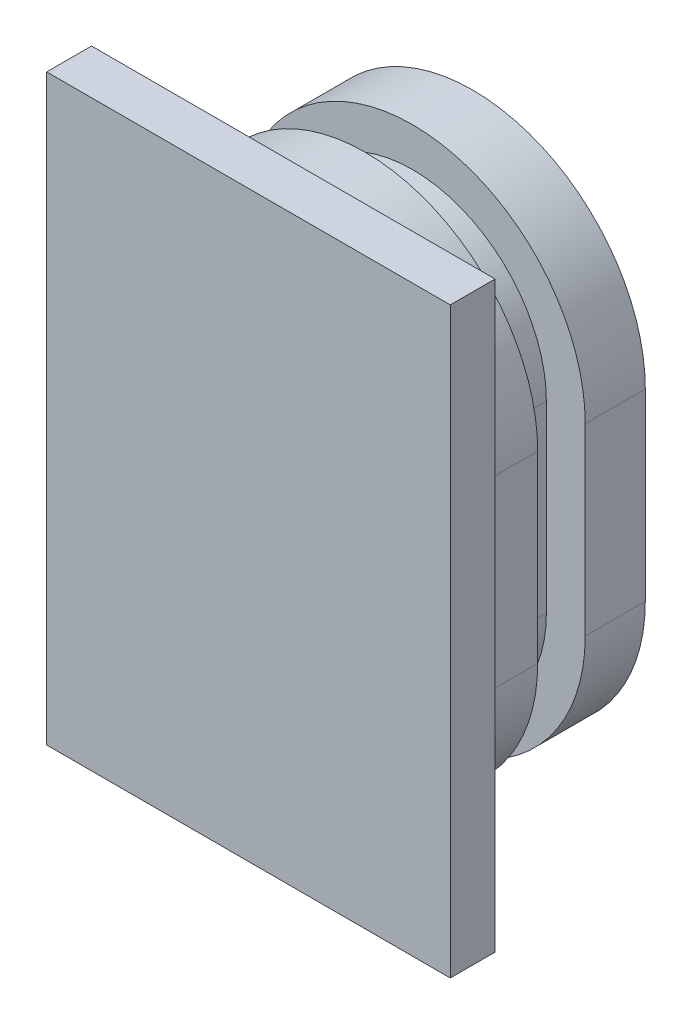
ISO-10303-21;
HEADER;
FILE_DESCRIPTION(('STEP AP214'),'2;1');
FILE_NAME('part.step','',(''),(''),'','','');
FILE_SCHEMA(('AUTOMOTIVE_DESIGN { 1 0 10303 214 1 1 1 1 }'));
ENDSEC;
DATA;
#1=APPLICATION_CONTEXT('core data for automotive mechanical design processes');
#2=APPLICATION_PROTOCOL_DEFINITION('international standard','automotive_design',2000,#1);
#3=PRODUCT_CONTEXT('',#1,'mechanical');
#4=PRODUCT('Part','Part','',(#3));
#5=PRODUCT_RELATED_PRODUCT_CATEGORY('part','',(#4));
#6=PRODUCT_DEFINITION_FORMATION('','',#4);
#7=PRODUCT_DEFINITION_CONTEXT('part definition',#1,'design');
#8=PRODUCT_DEFINITION('design','',#6,#7);
#9=PRODUCT_DEFINITION_SHAPE('','',#8);
#10=(LENGTH_UNIT() NAMED_UNIT(*) SI_UNIT(.MILLI.,.METRE.));
#11=(NAMED_UNIT(*) PLANE_ANGLE_UNIT() SI_UNIT($,.RADIAN.));
#12=(NAMED_UNIT(*) SI_UNIT($,.STERADIAN.) SOLID_ANGLE_UNIT());
#13=UNCERTAINTY_MEASURE_WITH_UNIT(LENGTH_MEASURE(1.E-05),#10,'distance_accuracy_value','');
#14=(GEOMETRIC_REPRESENTATION_CONTEXT(3) GLOBAL_UNCERTAINTY_ASSIGNED_CONTEXT((#13)) GLOBAL_UNIT_ASSIGNED_CONTEXT((#10,
#11,#12)) REPRESENTATION_CONTEXT('',''));
#15=CARTESIAN_POINT('',(0.,0.,0.));
#16=DIRECTION('',(0.,0.,1.));
#17=DIRECTION('',(1.,0.,0.));
#18=AXIS2_PLACEMENT_3D('',#15,#16,#17);
#19=CARTESIAN_POINT('',(2.88620795061788,-6.03673923854262,-20.));
#20=DIRECTION('',(0.,0.,-1.));
#21=DIRECTION('',(-1.,0.,0.));
#22=AXIS2_PLACEMENT_3D('',#19,#20,#21);
#23=PLANE('',#22);
#24=CARTESIAN_POINT('',(2.88620795061788,-6.03673923854262,-20.));
#25=DIRECTION('',(0.,0.,-1.));
#26=DIRECTION('',(-1.,0.,0.));
#27=AXIS2_PLACEMENT_3D('',#24,#25,#26);
#28=CIRCLE('',#27,19.25);
#29=CARTESIAN_POINT('',(-16.3637920493821,-6.03673923854262,-20.));
#30=VERTEX_POINT('',#29);
#31=CARTESIAN_POINT('',(22.1362079506179,-6.03673923854262,-20.));
#32=VERTEX_POINT('',#31);
#33=EDGE_CURVE('E302',#30,#32,#28,.T.);
#34=ORIENTED_EDGE('',*,*,#33,.T.);
#35=DIRECTION('',(0.,-1.,0.));
#36=VECTOR('',#35,1.);
#37=CARTESIAN_POINT('',(22.1362079506179,-6.03673923854262,-20.));
#38=LINE('',#37,#36);
#39=CARTESIAN_POINT('',(22.1362079506179,-26.5367392385426,-20.));
#40=VERTEX_POINT('',#39);
#41=EDGE_CURVE('E306',#32,#40,#38,.T.);
#42=ORIENTED_EDGE('',*,*,#41,.T.);
#43=CARTESIAN_POINT('',(2.88620795061788,-26.5367392385426,-20.));
#44=DIRECTION('',(0.,0.,-1.));
#45=DIRECTION('',(-1.,0.,0.));
#46=AXIS2_PLACEMENT_3D('',#43,#44,#45);
#47=CIRCLE('',#46,19.25);
#48=CARTESIAN_POINT('',(-16.3637920493821,-26.5367392385426,-20.));
#49=VERTEX_POINT('',#48);
#50=EDGE_CURVE('E310',#40,#49,#47,.T.);
#51=ORIENTED_EDGE('',*,*,#50,.T.);
#52=DIRECTION('',(0.,1.,0.));
#53=VECTOR('',#52,1.);
#54=CARTESIAN_POINT('',(-16.3637920493821,-6.03673923854262,-20.));
#55=LINE('',#54,#53);
#56=EDGE_CURVE('E313',#49,#30,#55,.T.);
#57=ORIENTED_EDGE('',*,*,#56,.T.);
#58=EDGE_LOOP('',(#34,#42,#51,#57));
#59=FACE_BOUND('',#58,.T.);
#60=DIRECTION('',(0.,-1.,0.));
#61=VECTOR('',#60,1.);
#62=CARTESIAN_POINT('',(13.6362079506179,-6.03673923854262,-20.));
#63=LINE('',#62,#61);
#64=CARTESIAN_POINT('',(13.6362079506179,-6.03673923854262,-20.));
#65=VERTEX_POINT('',#64);
#66=CARTESIAN_POINT('',(13.6362079506179,-26.5367392385426,-20.));
#67=VERTEX_POINT('',#66);
#68=EDGE_CURVE('E263',#65,#67,#63,.T.);
#69=ORIENTED_EDGE('',*,*,#68,.F.);
#70=CARTESIAN_POINT('',(2.88620795061788,-6.03673923854262,-20.));
#71=DIRECTION('',(0.,0.,-1.));
#72=DIRECTION('',(-1.,0.,0.));
#73=AXIS2_PLACEMENT_3D('',#70,#71,#72);
#74=CIRCLE('',#73,10.75);
#75=CARTESIAN_POINT('',(-7.86379204938211,-6.03673923854262,-20.));
#76=VERTEX_POINT('',#75);
#77=EDGE_CURVE('E260',#76,#65,#74,.T.);
#78=ORIENTED_EDGE('',*,*,#77,.F.);
#79=DIRECTION('',(0.,1.,0.));
#80=VECTOR('',#79,1.);
#81=CARTESIAN_POINT('',(-7.86379204938211,-6.03673923854262,-20.));
#82=LINE('',#81,#80);
#83=CARTESIAN_POINT('',(-7.86379204938211,-26.5367392385426,-20.));
#84=VERTEX_POINT('',#83);
#85=EDGE_CURVE('E271',#84,#76,#82,.T.);
#86=ORIENTED_EDGE('',*,*,#85,.F.);
#87=CARTESIAN_POINT('',(2.88620795061788,-26.5367392385426,-20.));
#88=DIRECTION('',(0.,0.,-1.));
#89=DIRECTION('',(-1.,0.,0.));
#90=AXIS2_PLACEMENT_3D('',#87,#88,#89);
#91=CIRCLE('',#90,10.75);
#92=EDGE_CURVE('E267',#67,#84,#91,.T.);
#93=ORIENTED_EDGE('',*,*,#92,.F.);
#94=EDGE_LOOP('',(#69,#78,#86,#93));
#95=FACE_BOUND('',#94,.T.);
#96=ADVANCED_FACE('F43',(#59,#95),#23,.T.);
#97=CARTESIAN_POINT('',(2.88620795061788,-6.03673923854262,-20.));
#98=DIRECTION('',(0.,0.,1.));
#99=DIRECTION('',(1.,0.,0.));
#100=AXIS2_PLACEMENT_3D('',#97,#98,#99);
#101=CYLINDRICAL_SURFACE('',#100,19.25);
#102=DIRECTION('',(0.,0.,1.));
#103=VECTOR('',#102,1.);
#104=CARTESIAN_POINT('',(-16.3637920493821,-6.03673923854262,-20.));
#105=LINE('',#104,#103);
#106=CARTESIAN_POINT('',(-16.3637920493821,-6.03673923854262,-13.3));
#107=VERTEX_POINT('',#106);
#108=EDGE_CURVE('E331',#30,#107,#105,.T.);
#109=ORIENTED_EDGE('',*,*,#108,.T.);
#110=CARTESIAN_POINT('',(2.88620795061788,-6.03673923854262,-13.3));
#111=DIRECTION('',(0.,0.,-1.));
#112=DIRECTION('',(-1.,0.,0.));
#113=AXIS2_PLACEMENT_3D('',#110,#111,#112);
#114=CIRCLE('',#113,19.25);
#115=CARTESIAN_POINT('',(22.1362079506179,-6.03673923854262,-13.3));
#116=VERTEX_POINT('',#115);
#117=EDGE_CURVE('E67',#107,#116,#114,.T.);
#118=ORIENTED_EDGE('',*,*,#117,.T.);
#119=DIRECTION('',(0.,0.,1.));
#120=VECTOR('',#119,1.);
#121=CARTESIAN_POINT('',(22.1362079506179,-6.03673923854262,-20.));
#122=LINE('',#121,#120);
#123=EDGE_CURVE('E346',#32,#116,#122,.T.);
#124=ORIENTED_EDGE('',*,*,#123,.F.);
#125=ORIENTED_EDGE('',*,*,#33,.F.);
#126=EDGE_LOOP('',(#109,#118,#124,#125));
#127=FACE_BOUND('',#126,.T.);
#128=ADVANCED_FACE('F416',(#127),#101,.T.);
#129=CARTESIAN_POINT('',(22.1362079506179,-6.03673923854262,-20.));
#130=DIRECTION('',(-1.,0.,0.));
#131=DIRECTION('',(0.,0.,1.));
#132=AXIS2_PLACEMENT_3D('',#129,#130,#131);
#133=PLANE('',#132);
#134=ORIENTED_EDGE('',*,*,#123,.T.);
#135=DIRECTION('',(0.,-1.,0.));
#136=VECTOR('',#135,1.);
#137=CARTESIAN_POINT('',(22.1362079506179,-6.03673923854262,-13.3));
#138=LINE('',#137,#136);
#139=CARTESIAN_POINT('',(22.1362079506179,-26.5367392385426,-13.3));
#140=VERTEX_POINT('',#139);
#141=EDGE_CURVE('E238',#116,#140,#138,.T.);
#142=ORIENTED_EDGE('',*,*,#141,.T.);
#143=DIRECTION('',(0.,0.,1.));
#144=VECTOR('',#143,1.);
#145=CARTESIAN_POINT('',(22.1362079506179,-26.5367392385426,-20.));
#146=LINE('',#145,#144);
#147=EDGE_CURVE('E341',#40,#140,#146,.T.);
#148=ORIENTED_EDGE('',*,*,#147,.F.);
#149=ORIENTED_EDGE('',*,*,#41,.F.);
#150=EDGE_LOOP('',(#134,#142,#148,#149));
#151=FACE_BOUND('',#150,.T.);
#152=ADVANCED_FACE('F422',(#151),#133,.F.);
#153=CARTESIAN_POINT('',(2.88620795061788,-26.5367392385426,-20.));
#154=DIRECTION('',(0.,0.,1.));
#155=DIRECTION('',(1.,0.,0.));
#156=AXIS2_PLACEMENT_3D('',#153,#154,#155);
#157=CYLINDRICAL_SURFACE('',#156,19.25);
#158=ORIENTED_EDGE('',*,*,#147,.T.);
#159=CARTESIAN_POINT('',(2.88620795061788,-26.5367392385426,-13.3));
#160=DIRECTION('',(0.,0.,-1.));
#161=DIRECTION('',(-1.,0.,0.));
#162=AXIS2_PLACEMENT_3D('',#159,#160,#161);
#163=CIRCLE('',#162,19.25);
#164=CARTESIAN_POINT('',(-16.3637920493821,-26.5367392385426,-13.3));
#165=VERTEX_POINT('',#164);
#166=EDGE_CURVE('E243',#140,#165,#163,.T.);
#167=ORIENTED_EDGE('',*,*,#166,.T.);
#168=DIRECTION('',(0.,0.,1.));
#169=VECTOR('',#168,1.);
#170=CARTESIAN_POINT('',(-16.3637920493821,-26.5367392385426,-20.));
#171=LINE('',#170,#169);
#172=EDGE_CURVE('E336',#49,#165,#171,.T.);
#173=ORIENTED_EDGE('',*,*,#172,.F.);
#174=ORIENTED_EDGE('',*,*,#50,.F.);
#175=EDGE_LOOP('',(#158,#167,#173,#174));
#176=FACE_BOUND('',#175,.T.);
#177=ADVANCED_FACE('F434',(#176),#157,.T.);
#178=CARTESIAN_POINT('',(-16.3637920493821,-6.03673923854262,-20.));
#179=DIRECTION('',(1.,0.,0.));
#180=DIRECTION('',(0.,0.,-1.));
#181=AXIS2_PLACEMENT_3D('',#178,#179,#180);
#182=PLANE('',#181);
#183=ORIENTED_EDGE('',*,*,#172,.T.);
#184=DIRECTION('',(0.,1.,0.));
#185=VECTOR('',#184,1.);
#186=CARTESIAN_POINT('',(-16.3637920493821,-6.03673923854262,-13.3));
#187=LINE('',#186,#185);
#188=EDGE_CURVE('E247',#165,#107,#187,.T.);
#189=ORIENTED_EDGE('',*,*,#188,.T.);
#190=ORIENTED_EDGE('',*,*,#108,.F.);
#191=ORIENTED_EDGE('',*,*,#56,.F.);
#192=EDGE_LOOP('',(#183,#189,#190,#191));
#193=FACE_BOUND('',#192,.T.);
#194=ADVANCED_FACE('F431',(#193),#182,.F.);
#195=CARTESIAN_POINT('',(2.88620795061788,-6.03673923854262,-20.));
#196=DIRECTION('',(0.,0.,1.));
#197=DIRECTION('',(1.,0.,0.));
#198=AXIS2_PLACEMENT_3D('',#195,#196,#197);
#199=CYLINDRICAL_SURFACE('',#198,10.75);
#200=CARTESIAN_POINT('',(2.88620795061788,-6.03673923854262,0.));
#201=DIRECTION('',(0.,0.,-1.));
#202=DIRECTION('',(-1.,0.,0.));
#203=AXIS2_PLACEMENT_3D('',#200,#201,#202);
#204=CIRCLE('',#203,10.75);
#205=CARTESIAN_POINT('',(-7.86379204938211,-6.03673923854262,0.));
#206=VERTEX_POINT('',#205);
#207=CARTESIAN_POINT('',(13.6362079506179,-6.03673923854262,0.));
#208=VERTEX_POINT('',#207);
#209=EDGE_CURVE('E250',#206,#208,#204,.T.);
#210=ORIENTED_EDGE('',*,*,#209,.F.);
#211=DIRECTION('',(0.,0.,1.));
#212=VECTOR('',#211,1.);
#213=CARTESIAN_POINT('',(-7.86379204938211,-6.03673923854262,-20.));
#214=LINE('',#213,#212);
#215=EDGE_CURVE('E274',#76,#206,#214,.T.);
#216=ORIENTED_EDGE('',*,*,#215,.F.);
#217=ORIENTED_EDGE('',*,*,#77,.T.);
#218=DIRECTION('',(0.,0.,1.));
#219=VECTOR('',#218,1.);
#220=CARTESIAN_POINT('',(13.6362079506179,-6.03673923854262,-20.));
#221=LINE('',#220,#219);
#222=EDGE_CURVE('E297',#65,#208,#221,.T.);
#223=ORIENTED_EDGE('',*,*,#222,.T.);
#224=EDGE_LOOP('',(#210,#216,#217,#223));
#225=FACE_BOUND('',#224,.T.);
#226=ADVANCED_FACE('F429',(#225),#199,.F.);
#227=CARTESIAN_POINT('',(13.6362079506179,-6.03673923854262,-20.));
#228=DIRECTION('',(-1.,0.,0.));
#229=DIRECTION('',(0.,-1.,0.));
#230=AXIS2_PLACEMENT_3D('',#227,#228,#229);
#231=PLANE('',#230);
#232=DIRECTION('',(0.,-1.,0.));
#233=VECTOR('',#232,1.);
#234=CARTESIAN_POINT('',(13.6362079506179,-6.03673923854262,0.));
#235=LINE('',#234,#233);
#236=CARTESIAN_POINT('',(13.6362079506179,-26.5367392385426,0.));
#237=VERTEX_POINT('',#236);
#238=EDGE_CURVE('E278',#208,#237,#235,.T.);
#239=ORIENTED_EDGE('',*,*,#238,.F.);
#240=ORIENTED_EDGE('',*,*,#222,.F.);
#241=ORIENTED_EDGE('',*,*,#68,.T.);
#242=DIRECTION('',(0.,0.,1.));
#243=VECTOR('',#242,1.);
#244=CARTESIAN_POINT('',(13.6362079506179,-26.5367392385426,-20.));
#245=LINE('',#244,#243);
#246=EDGE_CURVE('E294',#67,#237,#245,.T.);
#247=ORIENTED_EDGE('',*,*,#246,.T.);
#248=EDGE_LOOP('',(#239,#240,#241,#247));
#249=FACE_BOUND('',#248,.T.);
#250=ADVANCED_FACE('F508',(#249),#231,.T.);
#251=CARTESIAN_POINT('',(2.88620795061788,-26.5367392385426,-20.));
#252=DIRECTION('',(0.,0.,1.));
#253=DIRECTION('',(1.,0.,0.));
#254=AXIS2_PLACEMENT_3D('',#251,#252,#253);
#255=CYLINDRICAL_SURFACE('',#254,10.75);
#256=CARTESIAN_POINT('',(2.88620795061788,-26.5367392385426,0.));
#257=DIRECTION('',(0.,0.,-1.));
#258=DIRECTION('',(-1.,0.,0.));
#259=AXIS2_PLACEMENT_3D('',#256,#257,#258);
#260=CIRCLE('',#259,10.75);
#261=CARTESIAN_POINT('',(-7.86379204938211,-26.5367392385426,0.));
#262=VERTEX_POINT('',#261);
#263=EDGE_CURVE('E282',#237,#262,#260,.T.);
#264=ORIENTED_EDGE('',*,*,#263,.F.);
#265=ORIENTED_EDGE('',*,*,#246,.F.);
#266=ORIENTED_EDGE('',*,*,#92,.T.);
#267=DIRECTION('',(0.,0.,1.));
#268=VECTOR('',#267,1.);
#269=CARTESIAN_POINT('',(-7.86379204938211,-26.5367392385426,-20.));
#270=LINE('',#269,#268);
#271=EDGE_CURVE('E291',#84,#262,#270,.T.);
#272=ORIENTED_EDGE('',*,*,#271,.T.);
#273=EDGE_LOOP('',(#264,#265,#266,#272));
#274=FACE_BOUND('',#273,.T.);
#275=ADVANCED_FACE('F505',(#274),#255,.F.);
#276=CARTESIAN_POINT('',(-7.86379204938211,-6.03673923854262,-20.));
#277=DIRECTION('',(1.,0.,0.));
#278=DIRECTION('',(0.,1.,0.));
#279=AXIS2_PLACEMENT_3D('',#276,#277,#278);
#280=PLANE('',#279);
#281=DIRECTION('',(0.,1.,0.));
#282=VECTOR('',#281,1.);
#283=CARTESIAN_POINT('',(-7.86379204938211,-6.03673923854262,0.));
#284=LINE('',#283,#282);
#285=EDGE_CURVE('E264',#262,#206,#284,.T.);
#286=ORIENTED_EDGE('',*,*,#285,.F.);
#287=ORIENTED_EDGE('',*,*,#271,.F.);
#288=ORIENTED_EDGE('',*,*,#85,.T.);
#289=ORIENTED_EDGE('',*,*,#215,.T.);
#290=EDGE_LOOP('',(#286,#287,#288,#289));
#291=FACE_BOUND('',#290,.T.);
#292=ADVANCED_FACE('F448',(#291),#280,.T.);
#293=CARTESIAN_POINT('',(0.,0.,0.));
#294=DIRECTION('',(0.,0.,1.));
#295=DIRECTION('',(1.,0.,0.));
#296=AXIS2_PLACEMENT_3D('',#293,#294,#295);
#297=PLANE('',#296);
#298=ORIENTED_EDGE('',*,*,#285,.T.);
#299=ORIENTED_EDGE('',*,*,#209,.T.);
#300=ORIENTED_EDGE('',*,*,#238,.T.);
#301=ORIENTED_EDGE('',*,*,#263,.T.);
#302=EDGE_LOOP('',(#298,#299,#300,#301));
#303=FACE_BOUND('',#302,.T.);
#304=ADVANCED_FACE('F445',(#303),#297,.F.);
#305=CARTESIAN_POINT('',(2.88620795061788,-6.03673923854262,-13.3));
#306=DIRECTION('',(0.,0.,-1.));
#307=DIRECTION('',(-1.,0.,0.));
#308=AXIS2_PLACEMENT_3D('',#305,#306,#307);
#309=PLANE('',#308);
#310=ORIENTED_EDGE('',*,*,#117,.F.);
#311=ORIENTED_EDGE('',*,*,#188,.F.);
#312=ORIENTED_EDGE('',*,*,#166,.F.);
#313=ORIENTED_EDGE('',*,*,#141,.F.);
#314=EDGE_LOOP('',(#310,#311,#312,#313));
#315=FACE_BOUND('',#314,.T.);
#316=DIRECTION('',(0.,-1.,0.));
#317=VECTOR('',#316,1.);
#318=CARTESIAN_POINT('',(17.8022079506179,-6.03673923854262,-13.3));
#319=LINE('',#318,#317);
#320=CARTESIAN_POINT('',(17.8022079506179,-6.03673923854262,-13.3));
#321=VERTEX_POINT('',#320);
#322=CARTESIAN_POINT('',(17.8022079506179,-26.5367392385426,-13.3));
#323=VERTEX_POINT('',#322);
#324=EDGE_CURVE('E185',#321,#323,#319,.T.);
#325=ORIENTED_EDGE('',*,*,#324,.T.);
#326=CARTESIAN_POINT('',(2.88620795061788,-26.5367392385426,-13.3));
#327=DIRECTION('',(0.,0.,-1.));
#328=DIRECTION('',(-1.,0.,0.));
#329=AXIS2_PLACEMENT_3D('',#326,#327,#328);
#330=CIRCLE('',#329,14.916);
#331=CARTESIAN_POINT('',(-12.0297920493821,-26.5367392385426,-13.3));
#332=VERTEX_POINT('',#331);
#333=EDGE_CURVE('E209',#323,#332,#330,.T.);
#334=ORIENTED_EDGE('',*,*,#333,.T.);
#335=DIRECTION('',(0.,1.,0.));
#336=VECTOR('',#335,1.);
#337=CARTESIAN_POINT('',(-12.0297920493821,-6.03673923854262,-13.3));
#338=LINE('',#337,#336);
#339=CARTESIAN_POINT('',(-12.0297920493821,-6.03673923854262,-13.3));
#340=VERTEX_POINT('',#339);
#341=EDGE_CURVE('E188',#332,#340,#338,.T.);
#342=ORIENTED_EDGE('',*,*,#341,.T.);
#343=CARTESIAN_POINT('',(2.88620795061788,-6.03673923854262,-13.3));
#344=DIRECTION('',(0.,0.,-1.));
#345=DIRECTION('',(-1.,0.,0.));
#346=AXIS2_PLACEMENT_3D('',#343,#344,#345);
#347=CIRCLE('',#346,14.916);
#348=EDGE_CURVE('E180',#340,#321,#347,.T.);
#349=ORIENTED_EDGE('',*,*,#348,.T.);
#350=EDGE_LOOP('',(#325,#334,#342,#349));
#351=FACE_BOUND('',#350,.T.);
#352=ADVANCED_FACE('F182',(#315,#351),#309,.F.);
#353=CARTESIAN_POINT('',(2.88620795061788,-6.03673923854262,-8.));
#354=DIRECTION('',(0.,0.,-1.));
#355=DIRECTION('',(-1.,0.,0.));
#356=AXIS2_PLACEMENT_3D('',#353,#354,#355);
#357=PLANE('',#356);
#358=CARTESIAN_POINT('',(2.88620795061788,-6.03673923854262,-8.));
#359=DIRECTION('',(0.,0.,-1.));
#360=DIRECTION('',(-1.,0.,0.));
#361=AXIS2_PLACEMENT_3D('',#358,#359,#360);
#362=CIRCLE('',#361,19.25);
#363=CARTESIAN_POINT('',(-16.3637920493821,-6.03673923854262,-8.));
#364=VERTEX_POINT('',#363);
#365=CARTESIAN_POINT('',(22.1362079506179,-6.03673923854262,-8.));
#366=VERTEX_POINT('',#365);
#367=EDGE_CURVE('E203',#364,#366,#362,.T.);
#368=ORIENTED_EDGE('',*,*,#367,.T.);
#369=DIRECTION('',(0.,-1.,0.));
#370=VECTOR('',#369,1.);
#371=CARTESIAN_POINT('',(22.1362079506179,-6.03673923854262,-8.));
#372=LINE('',#371,#370);
#373=CARTESIAN_POINT('',(22.1362079506179,-26.5367392385426,-8.));
#374=VERTEX_POINT('',#373);
#375=EDGE_CURVE('E253',#366,#374,#372,.T.);
#376=ORIENTED_EDGE('',*,*,#375,.T.);
#377=CARTESIAN_POINT('',(2.88620795061788,-26.5367392385426,-8.));
#378=DIRECTION('',(0.,0.,-1.));
#379=DIRECTION('',(-1.,0.,0.));
#380=AXIS2_PLACEMENT_3D('',#377,#378,#379);
#381=CIRCLE('',#380,19.25);
#382=CARTESIAN_POINT('',(-16.3637920493821,-26.5367392385426,-8.));
#383=VERTEX_POINT('',#382);
#384=EDGE_CURVE('E59',#374,#383,#381,.T.);
#385=ORIENTED_EDGE('',*,*,#384,.T.);
#386=DIRECTION('',(0.,1.,0.));
#387=VECTOR('',#386,1.);
#388=CARTESIAN_POINT('',(-16.3637920493821,-6.03673923854262,-8.));
#389=LINE('',#388,#387);
#390=EDGE_CURVE('E239',#383,#364,#389,.T.);
#391=ORIENTED_EDGE('',*,*,#390,.T.);
#392=EDGE_LOOP('',(#368,#376,#385,#391));
#393=FACE_BOUND('',#392,.T.);
#394=CARTESIAN_POINT('',(2.88620795061788,-6.03673923854262,-8.));
#395=DIRECTION('',(0.,0.,-1.));
#396=DIRECTION('',(-1.,0.,0.));
#397=AXIS2_PLACEMENT_3D('',#394,#395,#396);
#398=CIRCLE('',#397,14.916);
#399=CARTESIAN_POINT('',(-12.0297920493821,-6.03673923854262,-8.));
#400=VERTEX_POINT('',#399);
#401=CARTESIAN_POINT('',(17.8022079506179,-6.03673923854262,-8.));
#402=VERTEX_POINT('',#401);
#403=EDGE_CURVE('E199',#400,#402,#398,.T.);
#404=ORIENTED_EDGE('',*,*,#403,.F.);
#405=DIRECTION('',(0.,1.,0.));
#406=VECTOR('',#405,1.);
#407=CARTESIAN_POINT('',(-12.0297920493821,-6.03673923854262,-8.));
#408=LINE('',#407,#406);
#409=CARTESIAN_POINT('',(-12.0297920493821,-26.5367392385426,-8.));
#410=VERTEX_POINT('',#409);
#411=EDGE_CURVE('E193',#410,#400,#408,.T.);
#412=ORIENTED_EDGE('',*,*,#411,.F.);
#413=CARTESIAN_POINT('',(2.88620795061788,-26.5367392385426,-8.));
#414=DIRECTION('',(0.,0.,-1.));
#415=DIRECTION('',(-1.,0.,0.));
#416=AXIS2_PLACEMENT_3D('',#413,#414,#415);
#417=CIRCLE('',#416,14.916);
#418=CARTESIAN_POINT('',(17.8022079506179,-26.5367392385426,-8.));
#419=VERTEX_POINT('',#418);
#420=EDGE_CURVE('E222',#419,#410,#417,.T.);
#421=ORIENTED_EDGE('',*,*,#420,.F.);
#422=DIRECTION('',(0.,-1.,0.));
#423=VECTOR('',#422,1.);
#424=CARTESIAN_POINT('',(17.8022079506179,-6.03673923854262,-8.));
#425=LINE('',#424,#423);
#426=EDGE_CURVE('E219',#402,#419,#425,.T.);
#427=ORIENTED_EDGE('',*,*,#426,.F.);
#428=EDGE_LOOP('',(#404,#412,#421,#427));
#429=FACE_BOUND('',#428,.T.);
#430=ADVANCED_FACE('F481',(#393,#429),#357,.T.);
#431=CARTESIAN_POINT('',(2.88620795061788,-6.03673923854262,-13.3));
#432=DIRECTION('',(0.,0.,1.));
#433=DIRECTION('',(1.,0.,0.));
#434=AXIS2_PLACEMENT_3D('',#431,#432,#433);
#435=CYLINDRICAL_SURFACE('',#434,14.916);
#436=ORIENTED_EDGE('',*,*,#403,.T.);
#437=DIRECTION('',(0.,0.,1.));
#438=VECTOR('',#437,1.);
#439=CARTESIAN_POINT('',(17.8022079506179,-6.03673923854262,-13.3));
#440=LINE('',#439,#438);
#441=EDGE_CURVE('E197',#321,#402,#440,.T.);
#442=ORIENTED_EDGE('',*,*,#441,.F.);
#443=ORIENTED_EDGE('',*,*,#348,.F.);
#444=DIRECTION('',(0.,0.,1.));
#445=VECTOR('',#444,1.);
#446=CARTESIAN_POINT('',(-12.0297920493821,-6.03673923854262,-13.3));
#447=LINE('',#446,#445);
#448=EDGE_CURVE('E216',#340,#400,#447,.T.);
#449=ORIENTED_EDGE('',*,*,#448,.T.);
#450=EDGE_LOOP('',(#436,#442,#443,#449));
#451=FACE_BOUND('',#450,.T.);
#452=ADVANCED_FACE('F198',(#451),#435,.T.);
#453=CARTESIAN_POINT('',(17.8022079506179,-6.03673923854262,-13.3));
#454=DIRECTION('',(-1.,0.,0.));
#455=DIRECTION('',(0.,0.,1.));
#456=AXIS2_PLACEMENT_3D('',#453,#454,#455);
#457=PLANE('',#456);
#458=ORIENTED_EDGE('',*,*,#426,.T.);
#459=DIRECTION('',(0.,0.,1.));
#460=VECTOR('',#459,1.);
#461=CARTESIAN_POINT('',(17.8022079506179,-26.5367392385426,-13.3));
#462=LINE('',#461,#460);
#463=EDGE_CURVE('E204',#323,#419,#462,.T.);
#464=ORIENTED_EDGE('',*,*,#463,.F.);
#465=ORIENTED_EDGE('',*,*,#324,.F.);
#466=ORIENTED_EDGE('',*,*,#441,.T.);
#467=EDGE_LOOP('',(#458,#464,#465,#466));
#468=FACE_BOUND('',#467,.T.);
#469=ADVANCED_FACE('F206',(#468),#457,.F.);
#470=CARTESIAN_POINT('',(2.88620795061788,-26.5367392385426,-13.3));
#471=DIRECTION('',(0.,0.,1.));
#472=DIRECTION('',(1.,0.,0.));
#473=AXIS2_PLACEMENT_3D('',#470,#471,#472);
#474=CYLINDRICAL_SURFACE('',#473,14.916);
#475=ORIENTED_EDGE('',*,*,#420,.T.);
#476=DIRECTION('',(0.,0.,1.));
#477=VECTOR('',#476,1.);
#478=CARTESIAN_POINT('',(-12.0297920493821,-26.5367392385426,-13.3));
#479=LINE('',#478,#477);
#480=EDGE_CURVE('E231',#332,#410,#479,.T.);
#481=ORIENTED_EDGE('',*,*,#480,.F.);
#482=ORIENTED_EDGE('',*,*,#333,.F.);
#483=ORIENTED_EDGE('',*,*,#463,.T.);
#484=EDGE_LOOP('',(#475,#481,#482,#483));
#485=FACE_BOUND('',#484,.T.);
#486=ADVANCED_FACE('F489',(#485),#474,.T.);
#487=CARTESIAN_POINT('',(-12.0297920493821,-6.03673923854262,-13.3));
#488=DIRECTION('',(1.,0.,0.));
#489=DIRECTION('',(0.,1.,0.));
#490=AXIS2_PLACEMENT_3D('',#487,#488,#489);
#491=PLANE('',#490);
#492=ORIENTED_EDGE('',*,*,#411,.T.);
#493=ORIENTED_EDGE('',*,*,#448,.F.);
#494=ORIENTED_EDGE('',*,*,#341,.F.);
#495=ORIENTED_EDGE('',*,*,#480,.T.);
#496=EDGE_LOOP('',(#492,#493,#494,#495));
#497=FACE_BOUND('',#496,.T.);
#498=ADVANCED_FACE('F413',(#497),#491,.F.);
#499=CARTESIAN_POINT('',(0.,0.,5.));
#500=DIRECTION('',(0.,0.,1.));
#501=DIRECTION('',(1.,0.,0.));
#502=AXIS2_PLACEMENT_3D('',#499,#500,#501);
#503=PLANE('',#502);
#504=DIRECTION('',(0.,-1.,0.));
#505=VECTOR('',#504,1.);
#506=CARTESIAN_POINT('',(-19.6137920493821,16.2132607614574,5.));
#507=LINE('',#506,#505);
#508=CARTESIAN_POINT('',(-19.6137920493821,16.2132607614574,5.));
#509=VERTEX_POINT('',#508);
#510=CARTESIAN_POINT('',(-19.6137920493821,-48.7867392385426,5.));
#511=VERTEX_POINT('',#510);
#512=EDGE_CURVE('E351',#509,#511,#507,.T.);
#513=ORIENTED_EDGE('',*,*,#512,.T.);
#514=DIRECTION('',(1.,0.,0.));
#515=VECTOR('',#514,1.);
#516=CARTESIAN_POINT('',(-19.6137920493821,-48.7867392385426,5.));
#517=LINE('',#516,#515);
#518=CARTESIAN_POINT('',(25.3862079506179,-48.7867392385426,5.));
#519=VERTEX_POINT('',#518);
#520=EDGE_CURVE('E355',#511,#519,#517,.T.);
#521=ORIENTED_EDGE('',*,*,#520,.T.);
#522=DIRECTION('',(0.,1.,0.));
#523=VECTOR('',#522,1.);
#524=CARTESIAN_POINT('',(25.3862079506179,16.2132607614574,5.));
#525=LINE('',#524,#523);
#526=CARTESIAN_POINT('',(25.3862079506179,16.2132607614574,5.));
#527=VERTEX_POINT('',#526);
#528=EDGE_CURVE('E359',#519,#527,#525,.T.);
#529=ORIENTED_EDGE('',*,*,#528,.T.);
#530=DIRECTION('',(-1.,0.,0.));
#531=VECTOR('',#530,1.);
#532=CARTESIAN_POINT('',(-19.6137920493821,16.2132607614574,5.));
#533=LINE('',#532,#531);
#534=EDGE_CURVE('E362',#527,#509,#533,.T.);
#535=ORIENTED_EDGE('',*,*,#534,.T.);
#536=EDGE_LOOP('',(#513,#521,#529,#535));
#537=FACE_BOUND('',#536,.T.);
#538=ADVANCED_FACE('F405',(#537),#503,.T.);
#539=CARTESIAN_POINT('',(-19.6137920493821,-48.7867392385426,5.));
#540=DIRECTION('',(0.,1.,0.));
#541=DIRECTION('',(0.,0.,1.));
#542=AXIS2_PLACEMENT_3D('',#539,#540,#541);
#543=PLANE('',#542);
#544=DIRECTION('',(1.,0.,0.));
#545=VECTOR('',#544,1.);
#546=CARTESIAN_POINT('',(-19.6137920493821,-48.7867392385426,0.));
#547=LINE('',#546,#545);
#548=CARTESIAN_POINT('',(-19.6137920493821,-48.7867392385426,0.));
#549=VERTEX_POINT('',#548);
#550=CARTESIAN_POINT('',(25.3862079506179,-48.7867392385426,0.));
#551=VERTEX_POINT('',#550);
#552=EDGE_CURVE('E369',#549,#551,#547,.T.);
#553=ORIENTED_EDGE('',*,*,#552,.T.);
#554=DIRECTION('',(0.,0.,-1.));
#555=VECTOR('',#554,1.);
#556=CARTESIAN_POINT('',(25.3862079506179,-48.7867392385426,5.));
#557=LINE('',#556,#555);
#558=EDGE_CURVE('E52',#519,#551,#557,.T.);
#559=ORIENTED_EDGE('',*,*,#558,.F.);
#560=ORIENTED_EDGE('',*,*,#520,.F.);
#561=DIRECTION('',(0.,0.,-1.));
#562=VECTOR('',#561,1.);
#563=CARTESIAN_POINT('',(-19.6137920493821,-48.7867392385426,5.));
#564=LINE('',#563,#562);
#565=EDGE_CURVE('E11',#511,#549,#564,.T.);
#566=ORIENTED_EDGE('',*,*,#565,.T.);
#567=EDGE_LOOP('',(#553,#559,#560,#566));
#568=FACE_BOUND('',#567,.T.);
#569=ADVANCED_FACE('F406',(#568),#543,.F.);
#570=CARTESIAN_POINT('',(25.3862079506179,16.2132607614574,5.));
#571=DIRECTION('',(-1.,0.,0.));
#572=DIRECTION('',(0.,-1.,0.));
#573=AXIS2_PLACEMENT_3D('',#570,#571,#572);
#574=PLANE('',#573);
#575=DIRECTION('',(0.,1.,0.));
#576=VECTOR('',#575,1.);
#577=CARTESIAN_POINT('',(25.3862079506179,16.2132607614574,0.));
#578=LINE('',#577,#576);
#579=CARTESIAN_POINT('',(25.3862079506179,16.2132607614574,0.));
#580=VERTEX_POINT('',#579);
#581=EDGE_CURVE('E372',#551,#580,#578,.T.);
#582=ORIENTED_EDGE('',*,*,#581,.T.);
#583=DIRECTION('',(0.,0.,-1.));
#584=VECTOR('',#583,1.);
#585=CARTESIAN_POINT('',(25.3862079506179,16.2132607614574,5.));
#586=LINE('',#585,#584);
#587=EDGE_CURVE('E380',#527,#580,#586,.T.);
#588=ORIENTED_EDGE('',*,*,#587,.F.);
#589=ORIENTED_EDGE('',*,*,#528,.F.);
#590=ORIENTED_EDGE('',*,*,#558,.T.);
#591=EDGE_LOOP('',(#582,#588,#589,#590));
#592=FACE_BOUND('',#591,.T.);
#593=ADVANCED_FACE('F389',(#592),#574,.F.);
#594=CARTESIAN_POINT('',(-19.6137920493821,16.2132607614574,5.));
#595=DIRECTION('',(0.,-1.,0.));
#596=DIRECTION('',(0.,0.,-1.));
#597=AXIS2_PLACEMENT_3D('',#594,#595,#596);
#598=PLANE('',#597);
#599=DIRECTION('',(-1.,0.,0.));
#600=VECTOR('',#599,1.);
#601=CARTESIAN_POINT('',(-19.6137920493821,16.2132607614574,0.));
#602=LINE('',#601,#600);
#603=CARTESIAN_POINT('',(-19.6137920493821,16.2132607614574,0.));
#604=VERTEX_POINT('',#603);
#605=EDGE_CURVE('E356',#580,#604,#602,.T.);
#606=ORIENTED_EDGE('',*,*,#605,.T.);
#607=DIRECTION('',(0.,0.,-1.));
#608=VECTOR('',#607,1.);
#609=CARTESIAN_POINT('',(-19.6137920493821,16.2132607614574,5.));
#610=LINE('',#609,#608);
#611=EDGE_CURVE('E365',#509,#604,#610,.T.);
#612=ORIENTED_EDGE('',*,*,#611,.F.);
#613=ORIENTED_EDGE('',*,*,#534,.F.);
#614=ORIENTED_EDGE('',*,*,#587,.T.);
#615=EDGE_LOOP('',(#606,#612,#613,#614));
#616=FACE_BOUND('',#615,.T.);
#617=ADVANCED_FACE('F399',(#616),#598,.F.);
#618=CARTESIAN_POINT('',(-19.6137920493821,16.2132607614574,5.));
#619=DIRECTION('',(1.,0.,0.));
#620=DIRECTION('',(0.,1.,0.));
#621=AXIS2_PLACEMENT_3D('',#618,#619,#620);
#622=PLANE('',#621);
#623=DIRECTION('',(0.,-1.,0.));
#624=VECTOR('',#623,1.);
#625=CARTESIAN_POINT('',(-19.6137920493821,16.2132607614574,0.));
#626=LINE('',#625,#624);
#627=EDGE_CURVE('E350',#604,#549,#626,.T.);
#628=ORIENTED_EDGE('',*,*,#627,.T.);
#629=ORIENTED_EDGE('',*,*,#565,.F.);
#630=ORIENTED_EDGE('',*,*,#512,.F.);
#631=ORIENTED_EDGE('',*,*,#611,.T.);
#632=EDGE_LOOP('',(#628,#629,#630,#631));
#633=FACE_BOUND('',#632,.T.);
#634=ADVANCED_FACE('F45',(#633),#622,.F.);
#635=ORIENTED_EDGE('',*,*,#627,.F.);
#636=ORIENTED_EDGE('',*,*,#605,.F.);
#637=ORIENTED_EDGE('',*,*,#581,.F.);
#638=ORIENTED_EDGE('',*,*,#552,.F.);
#639=EDGE_LOOP('',(#635,#636,#637,#638));
#640=FACE_BOUND('',#639,.T.);
#641=CARTESIAN_POINT('',(2.88620795061788,-6.03673923854262,0.));
#642=DIRECTION('',(0.,0.,-1.));
#643=DIRECTION('',(-1.,0.,0.));
#644=AXIS2_PLACEMENT_3D('',#641,#642,#643);
#645=CIRCLE('',#644,19.25);
#646=CARTESIAN_POINT('',(-16.3637920493821,-6.03673923854262,0.));
#647=VERTEX_POINT('',#646);
#648=CARTESIAN_POINT('',(22.1362079506179,-6.03673923854262,0.));
#649=VERTEX_POINT('',#648);
#650=EDGE_CURVE('E301',#647,#649,#645,.T.);
#651=ORIENTED_EDGE('',*,*,#650,.F.);
#652=DIRECTION('',(0.,1.,0.));
#653=VECTOR('',#652,1.);
#654=CARTESIAN_POINT('',(-16.3637920493821,-6.03673923854262,0.));
#655=LINE('',#654,#653);
#656=CARTESIAN_POINT('',(-16.3637920493821,-26.5367392385426,0.));
#657=VERTEX_POINT('',#656);
#658=EDGE_CURVE('E307',#657,#647,#655,.T.);
#659=ORIENTED_EDGE('',*,*,#658,.F.);
#660=CARTESIAN_POINT('',(2.88620795061788,-26.5367392385426,0.));
#661=DIRECTION('',(0.,0.,-1.));
#662=DIRECTION('',(-1.,0.,0.));
#663=AXIS2_PLACEMENT_3D('',#660,#661,#662);
#664=CIRCLE('',#663,19.25);
#665=CARTESIAN_POINT('',(22.1362079506179,-26.5367392385426,0.));
#666=VERTEX_POINT('',#665);
#667=EDGE_CURVE('E324',#666,#657,#664,.T.);
#668=ORIENTED_EDGE('',*,*,#667,.F.);
#669=DIRECTION('',(0.,-1.,0.));
#670=VECTOR('',#669,1.);
#671=CARTESIAN_POINT('',(22.1362079506179,-6.03673923854262,0.));
#672=LINE('',#671,#670);
#673=EDGE_CURVE('E320',#649,#666,#672,.T.);
#674=ORIENTED_EDGE('',*,*,#673,.F.);
#675=EDGE_LOOP('',(#651,#659,#668,#674));
#676=FACE_BOUND('',#675,.T.);
#677=ADVANCED_FACE('F395',(#640,#676),#297,.F.);
#678=ORIENTED_EDGE('',*,*,#390,.F.);
#679=EDGE_CURVE('E335',#383,#657,#171,.T.);
#680=ORIENTED_EDGE('',*,*,#679,.T.);
#681=ORIENTED_EDGE('',*,*,#658,.T.);
#682=EDGE_CURVE('E316',#364,#647,#105,.T.);
#683=ORIENTED_EDGE('',*,*,#682,.F.);
#684=EDGE_LOOP('',(#678,#680,#681,#683));
#685=FACE_BOUND('',#684,.T.);
#686=ADVANCED_FACE('F436',(#685),#182,.F.);
#687=ORIENTED_EDGE('',*,*,#384,.F.);
#688=EDGE_CURVE('E340',#374,#666,#146,.T.);
#689=ORIENTED_EDGE('',*,*,#688,.T.);
#690=ORIENTED_EDGE('',*,*,#667,.T.);
#691=ORIENTED_EDGE('',*,*,#679,.F.);
#692=EDGE_LOOP('',(#687,#689,#690,#691));
#693=FACE_BOUND('',#692,.T.);
#694=ADVANCED_FACE('F440',(#693),#157,.T.);
#695=ORIENTED_EDGE('',*,*,#375,.F.);
#696=EDGE_CURVE('E345',#366,#649,#122,.T.);
#697=ORIENTED_EDGE('',*,*,#696,.T.);
#698=ORIENTED_EDGE('',*,*,#673,.T.);
#699=ORIENTED_EDGE('',*,*,#688,.F.);
#700=EDGE_LOOP('',(#695,#697,#698,#699));
#701=FACE_BOUND('',#700,.T.);
#702=ADVANCED_FACE('F443',(#701),#133,.F.);
#703=ORIENTED_EDGE('',*,*,#367,.F.);
#704=ORIENTED_EDGE('',*,*,#682,.T.);
#705=ORIENTED_EDGE('',*,*,#650,.T.);
#706=ORIENTED_EDGE('',*,*,#696,.F.);
#707=EDGE_LOOP('',(#703,#704,#705,#706));
#708=FACE_BOUND('',#707,.T.);
#709=ADVANCED_FACE('F425',(#708),#101,.T.);
#710=CLOSED_SHELL('',(#96,#128,#152,#177,#194,#226,#250,#275,#292,#304,#352,#430,#452,#469,#486,
#498,#538,#569,#593,#617,#634,#677,#686,#694,#702,#709));
#711=MANIFOLD_SOLID_BREP('B2',#710);
#712=ADVANCED_BREP_SHAPE_REPRESENTATION('',(#18,#711),#14);
#713=SHAPE_DEFINITION_REPRESENTATION(#9,#712);
ENDSEC;
END-ISO-10303-21;
